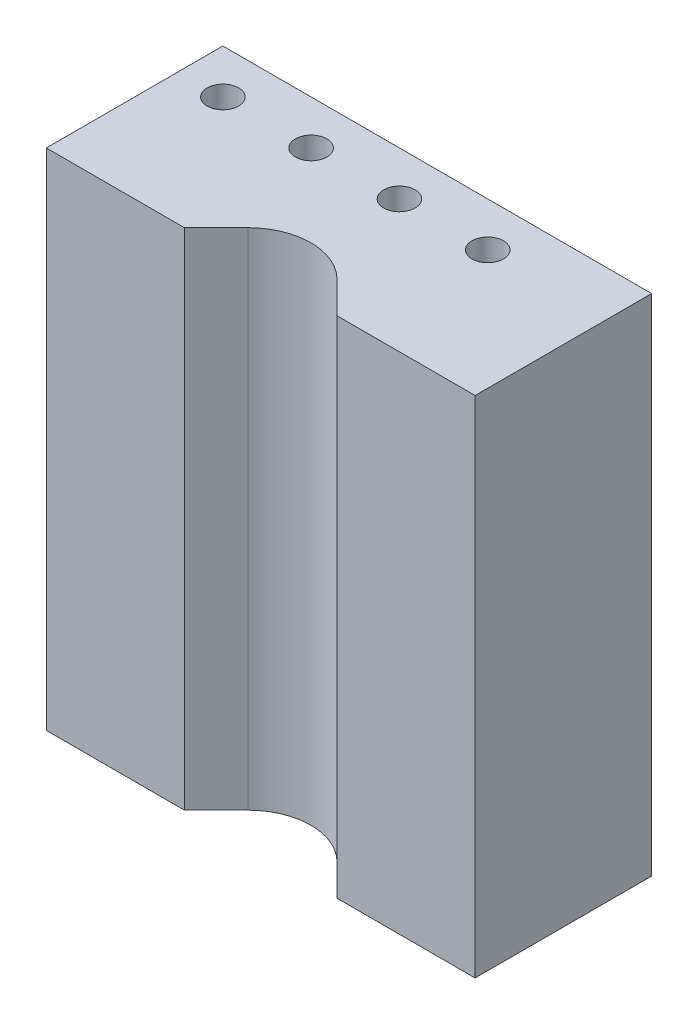
ISO-10303-21;
HEADER;
FILE_DESCRIPTION(('STEP AP214'),'2;1');
FILE_NAME('part.step','',(''),(''),'','','');
FILE_SCHEMA(('AUTOMOTIVE_DESIGN { 1 0 10303 214 1 1 1 1 }'));
ENDSEC;
DATA;
#1=APPLICATION_CONTEXT('core data for automotive mechanical design processes');
#2=APPLICATION_PROTOCOL_DEFINITION('international standard','automotive_design',2000,#1);
#3=PRODUCT_CONTEXT('',#1,'mechanical');
#4=PRODUCT('Part','Part','',(#3));
#5=PRODUCT_RELATED_PRODUCT_CATEGORY('part','',(#4));
#6=PRODUCT_DEFINITION_FORMATION('','',#4);
#7=PRODUCT_DEFINITION_CONTEXT('part definition',#1,'design');
#8=PRODUCT_DEFINITION('design','',#6,#7);
#9=PRODUCT_DEFINITION_SHAPE('','',#8);
#10=(LENGTH_UNIT() NAMED_UNIT(*) SI_UNIT(.MILLI.,.METRE.));
#11=(NAMED_UNIT(*) PLANE_ANGLE_UNIT() SI_UNIT($,.RADIAN.));
#12=(NAMED_UNIT(*) SI_UNIT($,.STERADIAN.) SOLID_ANGLE_UNIT());
#13=UNCERTAINTY_MEASURE_WITH_UNIT(LENGTH_MEASURE(1.E-05),#10,'distance_accuracy_value','');
#14=(GEOMETRIC_REPRESENTATION_CONTEXT(3) GLOBAL_UNCERTAINTY_ASSIGNED_CONTEXT((#13)) GLOBAL_UNIT_ASSIGNED_CONTEXT((#10,
#11,#12)) REPRESENTATION_CONTEXT('',''));
#15=CARTESIAN_POINT('',(0.,0.,0.));
#16=DIRECTION('',(0.,0.,1.));
#17=DIRECTION('',(1.,0.,0.));
#18=AXIS2_PLACEMENT_3D('',#15,#16,#17);
#19=CARTESIAN_POINT('',(7.44974746830583,40.,10.5));
#20=DIRECTION('',(-0.707106781186548,0.,-0.707106781186547));
#21=DIRECTION('',(-0.707106781186547,0.,0.707106781186548));
#22=AXIS2_PLACEMENT_3D('',#19,#20,#21);
#23=PLANE('',#22);
#24=DIRECTION('',(0.,1.,0.));
#25=VECTOR('',#24,1.);
#26=CARTESIAN_POINT('',(9.9644660940673,-7.90378556320243,7.98528137423854));
#27=LINE('',#26,#25);
#28=CARTESIAN_POINT('',(9.9644660940673,0.,7.98528137423853));
#29=VERTEX_POINT('',#28);
#30=CARTESIAN_POINT('',(9.9644660940673,40.,7.98528137423854));
#31=VERTEX_POINT('',#30);
#32=EDGE_CURVE('E63',#29,#31,#27,.T.);
#33=ORIENTED_EDGE('',*,*,#32,.T.);
#34=DIRECTION('',(0.707106781186547,0.,-0.707106781186548));
#35=VECTOR('',#34,1.);
#36=CARTESIAN_POINT('',(7.44974746830583,40.,10.5));
#37=LINE('',#36,#35);
#38=CARTESIAN_POINT('',(7.44974746830583,40.,10.5));
#39=VERTEX_POINT('',#38);
#40=EDGE_CURVE('E232',#39,#31,#37,.T.);
#41=ORIENTED_EDGE('',*,*,#40,.F.);
#42=DIRECTION('',(0.,-1.,0.));
#43=VECTOR('',#42,1.);
#44=CARTESIAN_POINT('',(7.44974746830583,40.,10.5));
#45=LINE('',#44,#43);
#46=CARTESIAN_POINT('',(7.44974746830583,0.,10.5));
#47=VERTEX_POINT('',#46);
#48=EDGE_CURVE('E270',#39,#47,#45,.T.);
#49=ORIENTED_EDGE('',*,*,#48,.T.);
#50=DIRECTION('',(0.707106781186547,0.,-0.707106781186548));
#51=VECTOR('',#50,1.);
#52=CARTESIAN_POINT('',(7.44974746830583,0.,10.5));
#53=LINE('',#52,#51);
#54=EDGE_CURVE('E68',#47,#29,#53,.T.);
#55=ORIENTED_EDGE('',*,*,#54,.T.);
#56=EDGE_LOOP('',(#33,#41,#49,#55));
#57=FACE_BOUND('',#56,.T.);
#58=ADVANCED_FACE('F47',(#57),#23,.F.);
#59=CARTESIAN_POINT('',(21.,40.,0.));
#60=DIRECTION('',(0.,-1.,0.));
#61=DIRECTION('',(0.,0.,-1.));
#62=AXIS2_PLACEMENT_3D('',#59,#60,#61);
#63=CYLINDRICAL_SURFACE('',#62,1.25);
#64=CARTESIAN_POINT('',(21.,40.,0.));
#65=DIRECTION('',(0.,1.,0.));
#66=DIRECTION('',(0.,0.,1.));
#67=AXIS2_PLACEMENT_3D('',#64,#65,#66);
#68=CIRCLE('',#67,1.25);
#69=CARTESIAN_POINT('',(21.,40.,1.25));
#70=VERTEX_POINT('',#69);
#71=EDGE_CURVE('E204',#70,#70,#68,.T.);
#72=ORIENTED_EDGE('',*,*,#71,.T.);
#73=EDGE_LOOP('',(#72));
#74=FACE_BOUND('',#73,.T.);
#75=CARTESIAN_POINT('',(21.,25.,0.));
#76=DIRECTION('',(0.,1.,0.));
#77=DIRECTION('',(0.,0.,1.));
#78=AXIS2_PLACEMENT_3D('',#75,#76,#77);
#79=CIRCLE('',#78,1.25);
#80=CARTESIAN_POINT('',(21.,25.,1.25));
#81=VERTEX_POINT('',#80);
#82=EDGE_CURVE('E165',#81,#81,#79,.T.);
#83=ORIENTED_EDGE('',*,*,#82,.F.);
#84=EDGE_LOOP('',(#83));
#85=FACE_BOUND('',#84,.T.);
#86=ADVANCED_FACE('F301',(#74,#85),#63,.F.);
#87=CARTESIAN_POINT('',(14.,40.,0.));
#88=DIRECTION('',(0.,-1.,0.));
#89=DIRECTION('',(0.,0.,-1.));
#90=AXIS2_PLACEMENT_3D('',#87,#88,#89);
#91=CYLINDRICAL_SURFACE('',#90,1.25);
#92=CARTESIAN_POINT('',(14.,40.,0.));
#93=DIRECTION('',(0.,1.,0.));
#94=DIRECTION('',(0.,0.,1.));
#95=AXIS2_PLACEMENT_3D('',#92,#93,#94);
#96=CIRCLE('',#95,1.25);
#97=CARTESIAN_POINT('',(14.,40.,1.25));
#98=VERTEX_POINT('',#97);
#99=EDGE_CURVE('E208',#98,#98,#96,.T.);
#100=ORIENTED_EDGE('',*,*,#99,.T.);
#101=EDGE_LOOP('',(#100));
#102=FACE_BOUND('',#101,.T.);
#103=CARTESIAN_POINT('',(14.,25.,0.));
#104=DIRECTION('',(0.,1.,0.));
#105=DIRECTION('',(0.,0.,1.));
#106=AXIS2_PLACEMENT_3D('',#103,#104,#105);
#107=CIRCLE('',#106,1.25);
#108=CARTESIAN_POINT('',(14.,25.,1.25));
#109=VERTEX_POINT('',#108);
#110=EDGE_CURVE('E170',#109,#109,#107,.T.);
#111=ORIENTED_EDGE('',*,*,#110,.F.);
#112=EDGE_LOOP('',(#111));
#113=FACE_BOUND('',#112,.T.);
#114=ADVANCED_FACE('F308',(#102,#113),#91,.F.);
#115=CARTESIAN_POINT('',(7.,40.,0.));
#116=DIRECTION('',(0.,-1.,0.));
#117=DIRECTION('',(0.,0.,-1.));
#118=AXIS2_PLACEMENT_3D('',#115,#116,#117);
#119=CYLINDRICAL_SURFACE('',#118,1.25);
#120=CARTESIAN_POINT('',(7.,40.,0.));
#121=DIRECTION('',(0.,1.,0.));
#122=DIRECTION('',(0.,0.,1.));
#123=AXIS2_PLACEMENT_3D('',#120,#121,#122);
#124=CIRCLE('',#123,1.25);
#125=CARTESIAN_POINT('',(7.,40.,1.25));
#126=VERTEX_POINT('',#125);
#127=EDGE_CURVE('E212',#126,#126,#124,.T.);
#128=ORIENTED_EDGE('',*,*,#127,.T.);
#129=EDGE_LOOP('',(#128));
#130=FACE_BOUND('',#129,.T.);
#131=CARTESIAN_POINT('',(7.,25.,0.));
#132=DIRECTION('',(0.,1.,0.));
#133=DIRECTION('',(0.,0.,1.));
#134=AXIS2_PLACEMENT_3D('',#131,#132,#133);
#135=CIRCLE('',#134,1.25);
#136=CARTESIAN_POINT('',(7.,25.,1.25));
#137=VERTEX_POINT('',#136);
#138=EDGE_CURVE('E174',#137,#137,#135,.T.);
#139=ORIENTED_EDGE('',*,*,#138,.F.);
#140=EDGE_LOOP('',(#139));
#141=FACE_BOUND('',#140,.T.);
#142=ADVANCED_FACE('F360',(#130,#141),#119,.F.);
#143=CARTESIAN_POINT('',(0.,40.,0.));
#144=DIRECTION('',(0.,-1.,0.));
#145=DIRECTION('',(0.,0.,-1.));
#146=AXIS2_PLACEMENT_3D('',#143,#144,#145);
#147=CYLINDRICAL_SURFACE('',#146,1.25);
#148=CARTESIAN_POINT('',(0.,40.,0.));
#149=DIRECTION('',(0.,1.,0.));
#150=DIRECTION('',(0.,0.,1.));
#151=AXIS2_PLACEMENT_3D('',#148,#149,#150);
#152=CIRCLE('',#151,1.25);
#153=CARTESIAN_POINT('',(0.,40.,1.25));
#154=VERTEX_POINT('',#153);
#155=EDGE_CURVE('E216',#154,#154,#152,.T.);
#156=ORIENTED_EDGE('',*,*,#155,.T.);
#157=EDGE_LOOP('',(#156));
#158=FACE_BOUND('',#157,.T.);
#159=CARTESIAN_POINT('',(0.,25.,0.));
#160=DIRECTION('',(0.,1.,0.));
#161=DIRECTION('',(0.,0.,1.));
#162=AXIS2_PLACEMENT_3D('',#159,#160,#161);
#163=CIRCLE('',#162,1.25);
#164=CARTESIAN_POINT('',(0.,25.,1.25));
#165=VERTEX_POINT('',#164);
#166=EDGE_CURVE('E164',#165,#165,#163,.T.);
#167=ORIENTED_EDGE('',*,*,#166,.F.);
#168=EDGE_LOOP('',(#167));
#169=FACE_BOUND('',#168,.T.);
#170=ADVANCED_FACE('F325',(#158,#169),#147,.F.);
#171=CARTESIAN_POINT('',(0.,40.,0.));
#172=DIRECTION('',(0.,1.,0.));
#173=DIRECTION('',(0.,0.,1.));
#174=AXIS2_PLACEMENT_3D('',#171,#172,#173);
#175=PLANE('',#174);
#176=ORIENTED_EDGE('',*,*,#99,.F.);
#177=EDGE_LOOP('',(#176));
#178=FACE_BOUND('',#177,.T.);
#179=ORIENTED_EDGE('',*,*,#155,.F.);
#180=EDGE_LOOP('',(#179));
#181=FACE_BOUND('',#180,.T.);
#182=DIRECTION('',(-1.,0.,0.));
#183=VECTOR('',#182,1.);
#184=CARTESIAN_POINT('',(24.5,40.,-3.5));
#185=LINE('',#184,#183);
#186=CARTESIAN_POINT('',(30.5,40.,-3.5));
#187=VERTEX_POINT('',#186);
#188=CARTESIAN_POINT('',(-3.5,40.,-3.5));
#189=VERTEX_POINT('',#188);
#190=EDGE_CURVE('E221',#187,#189,#185,.T.);
#191=ORIENTED_EDGE('',*,*,#190,.T.);
#192=DIRECTION('',(0.,0.,1.));
#193=VECTOR('',#192,1.);
#194=CARTESIAN_POINT('',(-3.5,40.,-3.5));
#195=LINE('',#194,#193);
#196=CARTESIAN_POINT('',(-3.5,40.,10.5));
#197=VERTEX_POINT('',#196);
#198=EDGE_CURVE('E225',#189,#197,#195,.T.);
#199=ORIENTED_EDGE('',*,*,#198,.T.);
#200=DIRECTION('',(1.,0.,0.));
#201=VECTOR('',#200,1.);
#202=CARTESIAN_POINT('',(-3.5,40.,10.5));
#203=LINE('',#202,#201);
#204=EDGE_CURVE('E229',#197,#39,#203,.T.);
#205=ORIENTED_EDGE('',*,*,#204,.T.);
#206=ORIENTED_EDGE('',*,*,#40,.T.);
#207=CARTESIAN_POINT('',(13.5,40.,11.5208152801713));
#208=DIRECTION('',(0.,1.,0.));
#209=DIRECTION('',(0.,0.,1.));
#210=AXIS2_PLACEMENT_3D('',#207,#208,#209);
#211=CIRCLE('',#210,5.);
#212=CARTESIAN_POINT('',(17.0355339059328,40.,7.98528137423854));
#213=VERTEX_POINT('',#212);
#214=EDGE_CURVE('E296',#31,#213,#211,.F.);
#215=ORIENTED_EDGE('',*,*,#214,.T.);
#216=DIRECTION('',(0.707106781186548,0.,0.707106781186547));
#217=VECTOR('',#216,1.);
#218=CARTESIAN_POINT('',(13.5042697938778,40.,4.45401726218361));
#219=LINE('',#218,#217);
#220=CARTESIAN_POINT('',(19.5502525316942,40.,10.5));
#221=VERTEX_POINT('',#220);
#222=EDGE_CURVE('E129',#213,#221,#219,.T.);
#223=ORIENTED_EDGE('',*,*,#222,.T.);
#224=DIRECTION('',(1.,0.,0.));
#225=VECTOR('',#224,1.);
#226=CARTESIAN_POINT('',(19.5502525316942,40.,10.5));
#227=LINE('',#226,#225);
#228=CARTESIAN_POINT('',(30.5,40.,10.5));
#229=VERTEX_POINT('',#228);
#230=EDGE_CURVE('E237',#221,#229,#227,.T.);
#231=ORIENTED_EDGE('',*,*,#230,.T.);
#232=DIRECTION('',(0.,0.,-1.));
#233=VECTOR('',#232,1.);
#234=CARTESIAN_POINT('',(30.5,40.,-3.5));
#235=LINE('',#234,#233);
#236=EDGE_CURVE('E240',#229,#187,#235,.T.);
#237=ORIENTED_EDGE('',*,*,#236,.T.);
#238=EDGE_LOOP('',(#191,#199,#205,#206,#215,#223,#231,#237));
#239=FACE_BOUND('',#238,.T.);
#240=ORIENTED_EDGE('',*,*,#127,.F.);
#241=EDGE_LOOP('',(#240));
#242=FACE_BOUND('',#241,.T.);
#243=ORIENTED_EDGE('',*,*,#71,.F.);
#244=EDGE_LOOP('',(#243));
#245=FACE_BOUND('',#244,.T.);
#246=ADVANCED_FACE('F294',(#178,#181,#239,#242,#245),#175,.T.);
#247=CARTESIAN_POINT('',(0.,0.,0.));
#248=DIRECTION('',(0.,1.,0.));
#249=DIRECTION('',(0.,0.,1.));
#250=AXIS2_PLACEMENT_3D('',#247,#248,#249);
#251=PLANE('',#250);
#252=CARTESIAN_POINT('',(13.5,0.,11.5208152801713));
#253=DIRECTION('',(0.,1.,0.));
#254=DIRECTION('',(0.,0.,1.));
#255=AXIS2_PLACEMENT_3D('',#252,#253,#254);
#256=CIRCLE('',#255,5.);
#257=CARTESIAN_POINT('',(17.0355339059328,0.,7.98528137423854));
#258=VERTEX_POINT('',#257);
#259=EDGE_CURVE('E118',#258,#29,#256,.T.);
#260=ORIENTED_EDGE('',*,*,#259,.T.);
#261=ORIENTED_EDGE('',*,*,#54,.F.);
#262=DIRECTION('',(1.,0.,0.));
#263=VECTOR('',#262,1.);
#264=CARTESIAN_POINT('',(1.44974746830591,0.,10.5));
#265=LINE('',#264,#263);
#266=CARTESIAN_POINT('',(-3.5,0.,10.5));
#267=VERTEX_POINT('',#266);
#268=EDGE_CURVE('E248',#267,#47,#265,.T.);
#269=ORIENTED_EDGE('',*,*,#268,.F.);
#270=DIRECTION('',(0.,0.,1.));
#271=VECTOR('',#270,1.);
#272=CARTESIAN_POINT('',(-3.5,0.,-3.5));
#273=LINE('',#272,#271);
#274=CARTESIAN_POINT('',(-3.5,0.,-3.5));
#275=VERTEX_POINT('',#274);
#276=EDGE_CURVE('E220',#275,#267,#273,.T.);
#277=ORIENTED_EDGE('',*,*,#276,.F.);
#278=DIRECTION('',(-1.,0.,0.));
#279=VECTOR('',#278,1.);
#280=CARTESIAN_POINT('',(24.5,0.,-3.5));
#281=LINE('',#280,#279);
#282=CARTESIAN_POINT('',(30.5,0.,-3.5));
#283=VERTEX_POINT('',#282);
#284=EDGE_CURVE('E226',#283,#275,#281,.T.);
#285=ORIENTED_EDGE('',*,*,#284,.F.);
#286=DIRECTION('',(0.,0.,-1.));
#287=VECTOR('',#286,1.);
#288=CARTESIAN_POINT('',(30.5,0.,-3.5));
#289=LINE('',#288,#287);
#290=CARTESIAN_POINT('',(30.5,0.,10.5));
#291=VERTEX_POINT('',#290);
#292=EDGE_CURVE('E255',#291,#283,#289,.T.);
#293=ORIENTED_EDGE('',*,*,#292,.F.);
#294=DIRECTION('',(1.,0.,0.));
#295=VECTOR('',#294,1.);
#296=CARTESIAN_POINT('',(30.5,0.,10.5));
#297=LINE('',#296,#295);
#298=CARTESIAN_POINT('',(19.5502525316942,0.,10.5));
#299=VERTEX_POINT('',#298);
#300=EDGE_CURVE('E120',#299,#291,#297,.T.);
#301=ORIENTED_EDGE('',*,*,#300,.F.);
#302=DIRECTION('',(0.707106781186548,0.,0.707106781186547));
#303=VECTOR('',#302,1.);
#304=CARTESIAN_POINT('',(13.5042697938778,0.,4.45401726218361));
#305=LINE('',#304,#303);
#306=EDGE_CURVE('E113',#258,#299,#305,.T.);
#307=ORIENTED_EDGE('',*,*,#306,.F.);
#308=EDGE_LOOP('',(#260,#261,#269,#277,#285,#293,#301,#307));
#309=FACE_BOUND('',#308,.T.);
#310=CARTESIAN_POINT('',(27.0000000000001,0.,7.));
#311=DIRECTION('',(0.,-1.,0.));
#312=DIRECTION('',(0.,0.,-1.));
#313=AXIS2_PLACEMENT_3D('',#310,#311,#312);
#314=CIRCLE('',#313,1.25);
#315=CARTESIAN_POINT('',(27.0000000000001,0.,5.75));
#316=VERTEX_POINT('',#315);
#317=EDGE_CURVE('E169',#316,#316,#314,.T.);
#318=ORIENTED_EDGE('',*,*,#317,.F.);
#319=EDGE_LOOP('',(#318));
#320=FACE_BOUND('',#319,.T.);
#321=CARTESIAN_POINT('',(27.,0.,0.));
#322=DIRECTION('',(0.,-1.,0.));
#323=DIRECTION('',(0.,0.,-1.));
#324=AXIS2_PLACEMENT_3D('',#321,#322,#323);
#325=CIRCLE('',#324,1.25);
#326=CARTESIAN_POINT('',(27.,0.,-1.25));
#327=VERTEX_POINT('',#326);
#328=EDGE_CURVE('E194',#327,#327,#325,.T.);
#329=ORIENTED_EDGE('',*,*,#328,.F.);
#330=EDGE_LOOP('',(#329));
#331=FACE_BOUND('',#330,.T.);
#332=CARTESIAN_POINT('',(20.,0.,0.));
#333=DIRECTION('',(0.,-1.,0.));
#334=DIRECTION('',(0.,0.,-1.));
#335=AXIS2_PLACEMENT_3D('',#332,#333,#334);
#336=CIRCLE('',#335,1.25);
#337=CARTESIAN_POINT('',(20.,0.,-1.25));
#338=VERTEX_POINT('',#337);
#339=EDGE_CURVE('E190',#338,#338,#336,.T.);
#340=ORIENTED_EDGE('',*,*,#339,.F.);
#341=EDGE_LOOP('',(#340));
#342=FACE_BOUND('',#341,.T.);
#343=CARTESIAN_POINT('',(13.,0.,0.));
#344=DIRECTION('',(0.,-1.,0.));
#345=DIRECTION('',(0.,0.,-1.));
#346=AXIS2_PLACEMENT_3D('',#343,#344,#345);
#347=CIRCLE('',#346,1.25);
#348=CARTESIAN_POINT('',(13.,0.,-1.25));
#349=VERTEX_POINT('',#348);
#350=EDGE_CURVE('E186',#349,#349,#347,.T.);
#351=ORIENTED_EDGE('',*,*,#350,.F.);
#352=EDGE_LOOP('',(#351));
#353=FACE_BOUND('',#352,.T.);
#354=CARTESIAN_POINT('',(6.,0.,0.));
#355=DIRECTION('',(0.,-1.,0.));
#356=DIRECTION('',(0.,0.,-1.));
#357=AXIS2_PLACEMENT_3D('',#354,#355,#356);
#358=CIRCLE('',#357,1.25);
#359=CARTESIAN_POINT('',(6.,0.,-1.25));
#360=VERTEX_POINT('',#359);
#361=EDGE_CURVE('E181',#360,#360,#358,.T.);
#362=ORIENTED_EDGE('',*,*,#361,.F.);
#363=EDGE_LOOP('',(#362));
#364=FACE_BOUND('',#363,.T.);
#365=CARTESIAN_POINT('',(6.00000000000007,0.,7.));
#366=DIRECTION('',(0.,-1.,0.));
#367=DIRECTION('',(0.,0.,-1.));
#368=AXIS2_PLACEMENT_3D('',#365,#366,#367);
#369=CIRCLE('',#368,1.25);
#370=CARTESIAN_POINT('',(6.00000000000007,0.,5.75));
#371=VERTEX_POINT('',#370);
#372=EDGE_CURVE('E185',#371,#371,#369,.T.);
#373=ORIENTED_EDGE('',*,*,#372,.F.);
#374=EDGE_LOOP('',(#373));
#375=FACE_BOUND('',#374,.T.);
#376=ADVANCED_FACE('F115',(#309,#320,#331,#342,#353,#364,#375),#251,.F.);
#377=CARTESIAN_POINT('',(-3.5,40.,-3.5));
#378=DIRECTION('',(1.,0.,0.));
#379=DIRECTION('',(0.,0.,-1.));
#380=AXIS2_PLACEMENT_3D('',#377,#378,#379);
#381=PLANE('',#380);
#382=ORIENTED_EDGE('',*,*,#276,.T.);
#383=DIRECTION('',(0.,-1.,0.));
#384=VECTOR('',#383,1.);
#385=CARTESIAN_POINT('',(-3.5,40.,10.5));
#386=LINE('',#385,#384);
#387=EDGE_CURVE('E56',#197,#267,#386,.T.);
#388=ORIENTED_EDGE('',*,*,#387,.F.);
#389=ORIENTED_EDGE('',*,*,#198,.F.);
#390=DIRECTION('',(0.,-1.,0.));
#391=VECTOR('',#390,1.);
#392=CARTESIAN_POINT('',(-3.5,40.,-3.5));
#393=LINE('',#392,#391);
#394=EDGE_CURVE('E11',#189,#275,#393,.T.);
#395=ORIENTED_EDGE('',*,*,#394,.T.);
#396=EDGE_LOOP('',(#382,#388,#389,#395));
#397=FACE_BOUND('',#396,.T.);
#398=ADVANCED_FACE('F49',(#397),#381,.F.);
#399=CARTESIAN_POINT('',(1.44974746830591,40.,10.5));
#400=DIRECTION('',(0.,0.,-1.));
#401=DIRECTION('',(-1.,0.,0.));
#402=AXIS2_PLACEMENT_3D('',#399,#400,#401);
#403=PLANE('',#402);
#404=ORIENTED_EDGE('',*,*,#268,.T.);
#405=ORIENTED_EDGE('',*,*,#48,.F.);
#406=ORIENTED_EDGE('',*,*,#204,.F.);
#407=ORIENTED_EDGE('',*,*,#387,.T.);
#408=EDGE_LOOP('',(#404,#405,#406,#407));
#409=FACE_BOUND('',#408,.T.);
#410=ADVANCED_FACE('F277',(#409),#403,.F.);
#411=CARTESIAN_POINT('',(13.5042697938778,40.,4.45401726218361));
#412=DIRECTION('',(0.707106781186547,0.,-0.707106781186548));
#413=DIRECTION('',(-0.707106781186548,0.,-0.707106781186547));
#414=AXIS2_PLACEMENT_3D('',#411,#412,#413);
#415=PLANE('',#414);
#416=ORIENTED_EDGE('',*,*,#222,.F.);
#417=DIRECTION('',(0.,1.,0.));
#418=VECTOR('',#417,1.);
#419=CARTESIAN_POINT('',(17.0355339059328,-7.90378556320243,7.98528137423854));
#420=LINE('',#419,#418);
#421=EDGE_CURVE('E127',#258,#213,#420,.T.);
#422=ORIENTED_EDGE('',*,*,#421,.F.);
#423=ORIENTED_EDGE('',*,*,#306,.T.);
#424=DIRECTION('',(0.,-1.,0.));
#425=VECTOR('',#424,1.);
#426=CARTESIAN_POINT('',(19.5502525316942,40.,10.5));
#427=LINE('',#426,#425);
#428=EDGE_CURVE('E267',#221,#299,#427,.T.);
#429=ORIENTED_EDGE('',*,*,#428,.F.);
#430=EDGE_LOOP('',(#416,#422,#423,#429));
#431=FACE_BOUND('',#430,.T.);
#432=ADVANCED_FACE('F128',(#431),#415,.F.);
#433=CARTESIAN_POINT('',(30.5,40.,10.5));
#434=DIRECTION('',(0.,0.,-1.));
#435=DIRECTION('',(-1.,0.,0.));
#436=AXIS2_PLACEMENT_3D('',#433,#434,#435);
#437=PLANE('',#436);
#438=ORIENTED_EDGE('',*,*,#300,.T.);
#439=DIRECTION('',(0.,-1.,0.));
#440=VECTOR('',#439,1.);
#441=CARTESIAN_POINT('',(30.5,40.,10.5));
#442=LINE('',#441,#440);
#443=EDGE_CURVE('E263',#229,#291,#442,.T.);
#444=ORIENTED_EDGE('',*,*,#443,.F.);
#445=ORIENTED_EDGE('',*,*,#230,.F.);
#446=ORIENTED_EDGE('',*,*,#428,.T.);
#447=EDGE_LOOP('',(#438,#444,#445,#446));
#448=FACE_BOUND('',#447,.T.);
#449=ADVANCED_FACE('F292',(#448),#437,.F.);
#450=CARTESIAN_POINT('',(30.5,40.,-3.5));
#451=DIRECTION('',(-1.,0.,0.));
#452=DIRECTION('',(0.,0.,1.));
#453=AXIS2_PLACEMENT_3D('',#450,#451,#452);
#454=PLANE('',#453);
#455=ORIENTED_EDGE('',*,*,#292,.T.);
#456=DIRECTION('',(0.,-1.,0.));
#457=VECTOR('',#456,1.);
#458=CARTESIAN_POINT('',(30.5,40.,-3.5));
#459=LINE('',#458,#457);
#460=EDGE_CURVE('E244',#187,#283,#459,.T.);
#461=ORIENTED_EDGE('',*,*,#460,.F.);
#462=ORIENTED_EDGE('',*,*,#236,.F.);
#463=ORIENTED_EDGE('',*,*,#443,.T.);
#464=EDGE_LOOP('',(#455,#461,#462,#463));
#465=FACE_BOUND('',#464,.T.);
#466=ADVANCED_FACE('F288',(#465),#454,.F.);
#467=CARTESIAN_POINT('',(24.5,40.,-3.5));
#468=DIRECTION('',(0.,0.,1.));
#469=DIRECTION('',(1.,0.,0.));
#470=AXIS2_PLACEMENT_3D('',#467,#468,#469);
#471=PLANE('',#470);
#472=ORIENTED_EDGE('',*,*,#284,.T.);
#473=ORIENTED_EDGE('',*,*,#394,.F.);
#474=ORIENTED_EDGE('',*,*,#190,.F.);
#475=ORIENTED_EDGE('',*,*,#460,.T.);
#476=EDGE_LOOP('',(#472,#473,#474,#475));
#477=FACE_BOUND('',#476,.T.);
#478=ADVANCED_FACE('F284',(#477),#471,.F.);
#479=CARTESIAN_POINT('',(6.00000000000007,10.,7.));
#480=DIRECTION('',(0.,-1.,0.));
#481=DIRECTION('',(0.,0.,-1.));
#482=AXIS2_PLACEMENT_3D('',#479,#480,#481);
#483=CYLINDRICAL_SURFACE('',#482,1.25);
#484=ORIENTED_EDGE('',*,*,#372,.T.);
#485=EDGE_LOOP('',(#484));
#486=FACE_BOUND('',#485,.T.);
#487=CARTESIAN_POINT('',(6.00000000000007,15.,7.));
#488=DIRECTION('',(0.,-1.,0.));
#489=DIRECTION('',(0.,0.,-1.));
#490=AXIS2_PLACEMENT_3D('',#487,#488,#489);
#491=CIRCLE('',#490,1.25);
#492=CARTESIAN_POINT('',(6.00000000000007,15.,5.75));
#493=VERTEX_POINT('',#492);
#494=EDGE_CURVE('E149',#493,#493,#491,.T.);
#495=ORIENTED_EDGE('',*,*,#494,.F.);
#496=EDGE_LOOP('',(#495));
#497=FACE_BOUND('',#496,.T.);
#498=ADVANCED_FACE('F332',(#486,#497),#483,.F.);
#499=CARTESIAN_POINT('',(6.,10.,0.));
#500=DIRECTION('',(0.,-1.,0.));
#501=DIRECTION('',(0.,0.,-1.));
#502=AXIS2_PLACEMENT_3D('',#499,#500,#501);
#503=CYLINDRICAL_SURFACE('',#502,1.25);
#504=ORIENTED_EDGE('',*,*,#361,.T.);
#505=EDGE_LOOP('',(#504));
#506=FACE_BOUND('',#505,.T.);
#507=CARTESIAN_POINT('',(6.,15.,0.));
#508=DIRECTION('',(0.,-1.,0.));
#509=DIRECTION('',(0.,0.,-1.));
#510=AXIS2_PLACEMENT_3D('',#507,#508,#509);
#511=CIRCLE('',#510,1.25);
#512=CARTESIAN_POINT('',(6.,15.,-1.25));
#513=VERTEX_POINT('',#512);
#514=EDGE_CURVE('E137',#513,#513,#511,.T.);
#515=ORIENTED_EDGE('',*,*,#514,.F.);
#516=EDGE_LOOP('',(#515));
#517=FACE_BOUND('',#516,.T.);
#518=ADVANCED_FACE('F422',(#506,#517),#503,.F.);
#519=CARTESIAN_POINT('',(13.,10.,0.));
#520=DIRECTION('',(0.,-1.,0.));
#521=DIRECTION('',(0.,0.,-1.));
#522=AXIS2_PLACEMENT_3D('',#519,#520,#521);
#523=CYLINDRICAL_SURFACE('',#522,1.25);
#524=ORIENTED_EDGE('',*,*,#350,.T.);
#525=EDGE_LOOP('',(#524));
#526=FACE_BOUND('',#525,.T.);
#527=CARTESIAN_POINT('',(13.,15.,0.));
#528=DIRECTION('',(0.,-1.,0.));
#529=DIRECTION('',(0.,0.,-1.));
#530=AXIS2_PLACEMENT_3D('',#527,#528,#529);
#531=CIRCLE('',#530,1.25);
#532=CARTESIAN_POINT('',(13.,15.,-1.25));
#533=VERTEX_POINT('',#532);
#534=EDGE_CURVE('E141',#533,#533,#531,.T.);
#535=ORIENTED_EDGE('',*,*,#534,.F.);
#536=EDGE_LOOP('',(#535));
#537=FACE_BOUND('',#536,.T.);
#538=ADVANCED_FACE('F431',(#526,#537),#523,.F.);
#539=CARTESIAN_POINT('',(20.,10.,0.));
#540=DIRECTION('',(0.,-1.,0.));
#541=DIRECTION('',(0.,0.,-1.));
#542=AXIS2_PLACEMENT_3D('',#539,#540,#541);
#543=CYLINDRICAL_SURFACE('',#542,1.25);
#544=ORIENTED_EDGE('',*,*,#339,.T.);
#545=EDGE_LOOP('',(#544));
#546=FACE_BOUND('',#545,.T.);
#547=CARTESIAN_POINT('',(20.,15.,0.));
#548=DIRECTION('',(0.,-1.,0.));
#549=DIRECTION('',(0.,0.,-1.));
#550=AXIS2_PLACEMENT_3D('',#547,#548,#549);
#551=CIRCLE('',#550,1.25);
#552=CARTESIAN_POINT('',(20.,15.,-1.25));
#553=VERTEX_POINT('',#552);
#554=EDGE_CURVE('E154',#553,#553,#551,.T.);
#555=ORIENTED_EDGE('',*,*,#554,.F.);
#556=EDGE_LOOP('',(#555));
#557=FACE_BOUND('',#556,.T.);
#558=ADVANCED_FACE('F440',(#546,#557),#543,.F.);
#559=CARTESIAN_POINT('',(27.,10.,0.));
#560=DIRECTION('',(0.,-1.,0.));
#561=DIRECTION('',(0.,0.,-1.));
#562=AXIS2_PLACEMENT_3D('',#559,#560,#561);
#563=CYLINDRICAL_SURFACE('',#562,1.25);
#564=ORIENTED_EDGE('',*,*,#328,.T.);
#565=EDGE_LOOP('',(#564));
#566=FACE_BOUND('',#565,.T.);
#567=CARTESIAN_POINT('',(27.,15.,0.));
#568=DIRECTION('',(0.,-1.,0.));
#569=DIRECTION('',(0.,0.,-1.));
#570=AXIS2_PLACEMENT_3D('',#567,#568,#569);
#571=CIRCLE('',#570,1.25);
#572=CARTESIAN_POINT('',(27.,15.,-1.25));
#573=VERTEX_POINT('',#572);
#574=EDGE_CURVE('E150',#573,#573,#571,.T.);
#575=ORIENTED_EDGE('',*,*,#574,.F.);
#576=EDGE_LOOP('',(#575));
#577=FACE_BOUND('',#576,.T.);
#578=ADVANCED_FACE('F449',(#566,#577),#563,.F.);
#579=CARTESIAN_POINT('',(27.0000000000001,10.,7.));
#580=DIRECTION('',(0.,-1.,0.));
#581=DIRECTION('',(0.,0.,-1.));
#582=AXIS2_PLACEMENT_3D('',#579,#580,#581);
#583=CYLINDRICAL_SURFACE('',#582,1.25);
#584=ORIENTED_EDGE('',*,*,#317,.T.);
#585=EDGE_LOOP('',(#584));
#586=FACE_BOUND('',#585,.T.);
#587=CARTESIAN_POINT('',(27.0000000000001,15.,7.));
#588=DIRECTION('',(0.,-1.,0.));
#589=DIRECTION('',(0.,0.,-1.));
#590=AXIS2_PLACEMENT_3D('',#587,#588,#589);
#591=CIRCLE('',#590,1.25);
#592=CARTESIAN_POINT('',(27.0000000000001,15.,5.75));
#593=VERTEX_POINT('',#592);
#594=EDGE_CURVE('E145',#593,#593,#591,.T.);
#595=ORIENTED_EDGE('',*,*,#594,.F.);
#596=EDGE_LOOP('',(#595));
#597=FACE_BOUND('',#596,.T.);
#598=ADVANCED_FACE('F386',(#586,#597),#583,.F.);
#599=CARTESIAN_POINT('',(21.,25.,0.));
#600=DIRECTION('',(0.,1.,0.));
#601=DIRECTION('',(0.,0.,1.));
#602=AXIS2_PLACEMENT_3D('',#599,#600,#601);
#603=PLANE('',#602);
#604=ORIENTED_EDGE('',*,*,#82,.T.);
#605=EDGE_LOOP('',(#604));
#606=FACE_BOUND('',#605,.T.);
#607=ADVANCED_FACE('F382',(#606),#603,.T.);
#608=CARTESIAN_POINT('',(14.,25.,0.));
#609=DIRECTION('',(0.,1.,0.));
#610=DIRECTION('',(0.,0.,1.));
#611=AXIS2_PLACEMENT_3D('',#608,#609,#610);
#612=PLANE('',#611);
#613=ORIENTED_EDGE('',*,*,#110,.T.);
#614=EDGE_LOOP('',(#613));
#615=FACE_BOUND('',#614,.T.);
#616=ADVANCED_FACE('F385',(#615),#612,.T.);
#617=CARTESIAN_POINT('',(7.,25.,0.));
#618=DIRECTION('',(0.,1.,0.));
#619=DIRECTION('',(0.,0.,1.));
#620=AXIS2_PLACEMENT_3D('',#617,#618,#619);
#621=PLANE('',#620);
#622=ORIENTED_EDGE('',*,*,#138,.T.);
#623=EDGE_LOOP('',(#622));
#624=FACE_BOUND('',#623,.T.);
#625=ADVANCED_FACE('F395',(#624),#621,.T.);
#626=CARTESIAN_POINT('',(0.,25.,0.));
#627=DIRECTION('',(0.,1.,0.));
#628=DIRECTION('',(0.,0.,1.));
#629=AXIS2_PLACEMENT_3D('',#626,#627,#628);
#630=PLANE('',#629);
#631=ORIENTED_EDGE('',*,*,#166,.T.);
#632=EDGE_LOOP('',(#631));
#633=FACE_BOUND('',#632,.T.);
#634=ADVANCED_FACE('F404',(#633),#630,.T.);
#635=CARTESIAN_POINT('',(27.0000000000001,15.,7.));
#636=DIRECTION('',(0.,-1.,0.));
#637=DIRECTION('',(0.,0.,-1.));
#638=AXIS2_PLACEMENT_3D('',#635,#636,#637);
#639=PLANE('',#638);
#640=ORIENTED_EDGE('',*,*,#594,.T.);
#641=EDGE_LOOP('',(#640));
#642=FACE_BOUND('',#641,.T.);
#643=ADVANCED_FACE('F413',(#642),#639,.T.);
#644=CARTESIAN_POINT('',(27.,15.,0.));
#645=DIRECTION('',(0.,-1.,0.));
#646=DIRECTION('',(0.,0.,-1.));
#647=AXIS2_PLACEMENT_3D('',#644,#645,#646);
#648=PLANE('',#647);
#649=ORIENTED_EDGE('',*,*,#574,.T.);
#650=EDGE_LOOP('',(#649));
#651=FACE_BOUND('',#650,.T.);
#652=ADVANCED_FACE('F474',(#651),#648,.T.);
#653=CARTESIAN_POINT('',(20.,15.,0.));
#654=DIRECTION('',(0.,-1.,0.));
#655=DIRECTION('',(0.,0.,-1.));
#656=AXIS2_PLACEMENT_3D('',#653,#654,#655);
#657=PLANE('',#656);
#658=ORIENTED_EDGE('',*,*,#554,.T.);
#659=EDGE_LOOP('',(#658));
#660=FACE_BOUND('',#659,.T.);
#661=ADVANCED_FACE('F483',(#660),#657,.T.);
#662=CARTESIAN_POINT('',(13.,15.,0.));
#663=DIRECTION('',(0.,-1.,0.));
#664=DIRECTION('',(0.,0.,-1.));
#665=AXIS2_PLACEMENT_3D('',#662,#663,#664);
#666=PLANE('',#665);
#667=ORIENTED_EDGE('',*,*,#534,.T.);
#668=EDGE_LOOP('',(#667));
#669=FACE_BOUND('',#668,.T.);
#670=ADVANCED_FACE('F492',(#669),#666,.T.);
#671=CARTESIAN_POINT('',(6.,15.,0.));
#672=DIRECTION('',(0.,-1.,0.));
#673=DIRECTION('',(0.,0.,-1.));
#674=AXIS2_PLACEMENT_3D('',#671,#672,#673);
#675=PLANE('',#674);
#676=ORIENTED_EDGE('',*,*,#514,.T.);
#677=EDGE_LOOP('',(#676));
#678=FACE_BOUND('',#677,.T.);
#679=ADVANCED_FACE('F501',(#678),#675,.T.);
#680=CARTESIAN_POINT('',(6.00000000000007,15.,7.));
#681=DIRECTION('',(0.,-1.,0.));
#682=DIRECTION('',(0.,0.,-1.));
#683=AXIS2_PLACEMENT_3D('',#680,#681,#682);
#684=PLANE('',#683);
#685=ORIENTED_EDGE('',*,*,#494,.T.);
#686=EDGE_LOOP('',(#685));
#687=FACE_BOUND('',#686,.T.);
#688=ADVANCED_FACE('F509',(#687),#684,.T.);
#689=CARTESIAN_POINT('',(13.5,-7.90378556320243,11.5208152801713));
#690=DIRECTION('',(0.,1.,0.));
#691=DIRECTION('',(0.,0.,1.));
#692=AXIS2_PLACEMENT_3D('',#689,#690,#691);
#693=CYLINDRICAL_SURFACE('',#692,5.);
#694=ORIENTED_EDGE('',*,*,#259,.F.);
#695=ORIENTED_EDGE('',*,*,#421,.T.);
#696=ORIENTED_EDGE('',*,*,#214,.F.);
#697=ORIENTED_EDGE('',*,*,#32,.F.);
#698=EDGE_LOOP('',(#694,#695,#696,#697));
#699=FACE_BOUND('',#698,.T.);
#700=ADVANCED_FACE('F135',(#699),#693,.F.);
#701=CLOSED_SHELL('',(#58,#86,#114,#142,#170,#246,#376,#398,#410,#432,#449,#466,#478,#498,#518,
#538,#558,#578,#598,#607,#616,#625,#634,#643,#652,#661,#670,#679,#688,#700));
#702=MANIFOLD_SOLID_BREP('B2',#701);
#703=ADVANCED_BREP_SHAPE_REPRESENTATION('',(#18,#702),#14);
#704=SHAPE_DEFINITION_REPRESENTATION(#9,#703);
ENDSEC;
END-ISO-10303-21;
